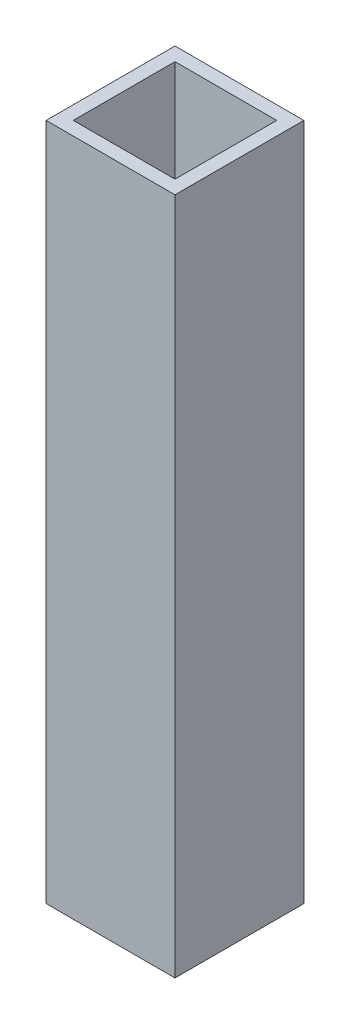
ISO-10303-21;
HEADER;
FILE_DESCRIPTION(('STEP AP214'),'2;1');
FILE_NAME('part.step','',(''),(''),'','','');
FILE_SCHEMA(('AUTOMOTIVE_DESIGN { 1 0 10303 214 1 1 1 1 }'));
ENDSEC;
DATA;
#1=APPLICATION_CONTEXT('core data for automotive mechanical design processes');
#2=APPLICATION_PROTOCOL_DEFINITION('international standard','automotive_design',2000,#1);
#3=PRODUCT_CONTEXT('',#1,'mechanical');
#4=PRODUCT('Part','Part','',(#3));
#5=PRODUCT_RELATED_PRODUCT_CATEGORY('part','',(#4));
#6=PRODUCT_DEFINITION_FORMATION('','',#4);
#7=PRODUCT_DEFINITION_CONTEXT('part definition',#1,'design');
#8=PRODUCT_DEFINITION('design','',#6,#7);
#9=PRODUCT_DEFINITION_SHAPE('','',#8);
#10=(LENGTH_UNIT() NAMED_UNIT(*) SI_UNIT(.MILLI.,.METRE.));
#11=(NAMED_UNIT(*) PLANE_ANGLE_UNIT() SI_UNIT($,.RADIAN.));
#12=(NAMED_UNIT(*) SI_UNIT($,.STERADIAN.) SOLID_ANGLE_UNIT());
#13=UNCERTAINTY_MEASURE_WITH_UNIT(LENGTH_MEASURE(1.E-05),#10,'distance_accuracy_value','');
#14=(GEOMETRIC_REPRESENTATION_CONTEXT(3) GLOBAL_UNCERTAINTY_ASSIGNED_CONTEXT((#13)) GLOBAL_UNIT_ASSIGNED_CONTEXT((#10,
#11,#12)) REPRESENTATION_CONTEXT('',''));
#15=CARTESIAN_POINT('',(0.,0.,0.));
#16=DIRECTION('',(0.,0.,1.));
#17=DIRECTION('',(1.,0.,0.));
#18=AXIS2_PLACEMENT_3D('',#15,#16,#17);
#19=CARTESIAN_POINT('',(0.,100.,0.));
#20=DIRECTION('',(0.,1.,0.));
#21=DIRECTION('',(0.,0.,1.));
#22=AXIS2_PLACEMENT_3D('',#19,#20,#21);
#23=PLANE('',#22);
#24=DIRECTION('',(0.,0.,-1.));
#25=VECTOR('',#24,1.);
#26=CARTESIAN_POINT('',(9.5,100.,9.5));
#27=LINE('',#26,#25);
#28=CARTESIAN_POINT('',(9.5,100.,9.5));
#29=VERTEX_POINT('',#28);
#30=CARTESIAN_POINT('',(9.5,100.,-9.5));
#31=VERTEX_POINT('',#30);
#32=EDGE_CURVE('E181',#29,#31,#27,.T.);
#33=ORIENTED_EDGE('',*,*,#32,.T.);
#34=DIRECTION('',(-1.,0.,0.));
#35=VECTOR('',#34,1.);
#36=CARTESIAN_POINT('',(-9.5,100.,-9.5));
#37=LINE('',#36,#35);
#38=CARTESIAN_POINT('',(-9.5,100.,-9.5));
#39=VERTEX_POINT('',#38);
#40=EDGE_CURVE('E185',#31,#39,#37,.T.);
#41=ORIENTED_EDGE('',*,*,#40,.T.);
#42=DIRECTION('',(0.,0.,1.));
#43=VECTOR('',#42,1.);
#44=CARTESIAN_POINT('',(-9.5,100.,9.5));
#45=LINE('',#44,#43);
#46=CARTESIAN_POINT('',(-9.5,100.,9.5));
#47=VERTEX_POINT('',#46);
#48=EDGE_CURVE('E189',#39,#47,#45,.T.);
#49=ORIENTED_EDGE('',*,*,#48,.T.);
#50=DIRECTION('',(1.,0.,0.));
#51=VECTOR('',#50,1.);
#52=CARTESIAN_POINT('',(-9.5,100.,9.5));
#53=LINE('',#52,#51);
#54=EDGE_CURVE('E192',#47,#29,#53,.T.);
#55=ORIENTED_EDGE('',*,*,#54,.T.);
#56=EDGE_LOOP('',(#33,#41,#49,#55));
#57=FACE_BOUND('',#56,.T.);
#58=DIRECTION('',(-1.,0.,0.));
#59=VECTOR('',#58,1.);
#60=CARTESIAN_POINT('',(0.,100.,-7.5));
#61=LINE('',#60,#59);
#62=CARTESIAN_POINT('',(7.5,100.,-7.5));
#63=VERTEX_POINT('',#62);
#64=CARTESIAN_POINT('',(-7.5,100.,-7.5));
#65=VERTEX_POINT('',#64);
#66=EDGE_CURVE('E142',#63,#65,#61,.T.);
#67=ORIENTED_EDGE('',*,*,#66,.F.);
#68=DIRECTION('',(0.,0.,-1.));
#69=VECTOR('',#68,1.);
#70=CARTESIAN_POINT('',(7.5,100.,0.));
#71=LINE('',#70,#69);
#72=CARTESIAN_POINT('',(7.5,100.,7.5));
#73=VERTEX_POINT('',#72);
#74=EDGE_CURVE('E133',#73,#63,#71,.T.);
#75=ORIENTED_EDGE('',*,*,#74,.F.);
#76=DIRECTION('',(1.,0.,0.));
#77=VECTOR('',#76,1.);
#78=CARTESIAN_POINT('',(0.,100.,7.5));
#79=LINE('',#78,#77);
#80=CARTESIAN_POINT('',(-7.5,100.,7.5));
#81=VERTEX_POINT('',#80);
#82=EDGE_CURVE('E159',#81,#73,#79,.T.);
#83=ORIENTED_EDGE('',*,*,#82,.F.);
#84=DIRECTION('',(0.,0.,1.));
#85=VECTOR('',#84,1.);
#86=CARTESIAN_POINT('',(-7.5,100.,0.));
#87=LINE('',#86,#85);
#88=EDGE_CURVE('E155',#65,#81,#87,.T.);
#89=ORIENTED_EDGE('',*,*,#88,.F.);
#90=EDGE_LOOP('',(#67,#75,#83,#89));
#91=FACE_BOUND('',#90,.T.);
#92=ADVANCED_FACE('F67',(#57,#91),#23,.T.);
#93=CARTESIAN_POINT('',(0.,0.,0.));
#94=DIRECTION('',(0.,1.,0.));
#95=DIRECTION('',(0.,0.,1.));
#96=AXIS2_PLACEMENT_3D('',#93,#94,#95);
#97=PLANE('',#96);
#98=DIRECTION('',(0.,0.,-1.));
#99=VECTOR('',#98,1.);
#100=CARTESIAN_POINT('',(9.5,0.,9.5));
#101=LINE('',#100,#99);
#102=CARTESIAN_POINT('',(9.5,0.,9.5));
#103=VERTEX_POINT('',#102);
#104=CARTESIAN_POINT('',(9.5,0.,-9.5));
#105=VERTEX_POINT('',#104);
#106=EDGE_CURVE('E151',#103,#105,#101,.T.);
#107=ORIENTED_EDGE('',*,*,#106,.F.);
#108=DIRECTION('',(1.,0.,0.));
#109=VECTOR('',#108,1.);
#110=CARTESIAN_POINT('',(-9.5,0.,9.5));
#111=LINE('',#110,#109);
#112=CARTESIAN_POINT('',(-9.5,0.,9.5));
#113=VERTEX_POINT('',#112);
#114=EDGE_CURVE('E186',#113,#103,#111,.T.);
#115=ORIENTED_EDGE('',*,*,#114,.F.);
#116=DIRECTION('',(0.,0.,1.));
#117=VECTOR('',#116,1.);
#118=CARTESIAN_POINT('',(-9.5,0.,9.5));
#119=LINE('',#118,#117);
#120=CARTESIAN_POINT('',(-9.5,0.,-9.5));
#121=VERTEX_POINT('',#120);
#122=EDGE_CURVE('E202',#121,#113,#119,.T.);
#123=ORIENTED_EDGE('',*,*,#122,.F.);
#124=DIRECTION('',(-1.,0.,0.));
#125=VECTOR('',#124,1.);
#126=CARTESIAN_POINT('',(-9.5,0.,-9.5));
#127=LINE('',#126,#125);
#128=EDGE_CURVE('E199',#105,#121,#127,.T.);
#129=ORIENTED_EDGE('',*,*,#128,.F.);
#130=EDGE_LOOP('',(#107,#115,#123,#129));
#131=FACE_BOUND('',#130,.T.);
#132=DIRECTION('',(0.,0.,-1.));
#133=VECTOR('',#132,1.);
#134=CARTESIAN_POINT('',(7.5,0.,0.));
#135=LINE('',#134,#133);
#136=CARTESIAN_POINT('',(7.5,0.,7.5));
#137=VERTEX_POINT('',#136);
#138=CARTESIAN_POINT('',(7.5,0.,-7.5));
#139=VERTEX_POINT('',#138);
#140=EDGE_CURVE('E91',#137,#139,#135,.T.);
#141=ORIENTED_EDGE('',*,*,#140,.T.);
#142=DIRECTION('',(-1.,0.,0.));
#143=VECTOR('',#142,1.);
#144=CARTESIAN_POINT('',(0.,0.,-7.5));
#145=LINE('',#144,#143);
#146=CARTESIAN_POINT('',(-7.5,0.,-7.5));
#147=VERTEX_POINT('',#146);
#148=EDGE_CURVE('E149',#139,#147,#145,.T.);
#149=ORIENTED_EDGE('',*,*,#148,.T.);
#150=DIRECTION('',(0.,0.,1.));
#151=VECTOR('',#150,1.);
#152=CARTESIAN_POINT('',(-7.5,0.,0.));
#153=LINE('',#152,#151);
#154=CARTESIAN_POINT('',(-7.5,0.,7.5));
#155=VERTEX_POINT('',#154);
#156=EDGE_CURVE('E168',#147,#155,#153,.T.);
#157=ORIENTED_EDGE('',*,*,#156,.T.);
#158=DIRECTION('',(1.,0.,0.));
#159=VECTOR('',#158,1.);
#160=CARTESIAN_POINT('',(0.,0.,7.5));
#161=LINE('',#160,#159);
#162=EDGE_CURVE('E143',#155,#137,#161,.T.);
#163=ORIENTED_EDGE('',*,*,#162,.T.);
#164=EDGE_LOOP('',(#141,#149,#157,#163));
#165=FACE_BOUND('',#164,.T.);
#166=ADVANCED_FACE('F225',(#131,#165),#97,.F.);
#167=CARTESIAN_POINT('',(9.5,100.,9.5));
#168=DIRECTION('',(-1.,0.,0.));
#169=DIRECTION('',(0.,0.,1.));
#170=AXIS2_PLACEMENT_3D('',#167,#168,#169);
#171=PLANE('',#170);
#172=ORIENTED_EDGE('',*,*,#106,.T.);
#173=DIRECTION('',(0.,-1.,0.));
#174=VECTOR('',#173,1.);
#175=CARTESIAN_POINT('',(9.5,100.,-9.5));
#176=LINE('',#175,#174);
#177=EDGE_CURVE('E12',#31,#105,#176,.T.);
#178=ORIENTED_EDGE('',*,*,#177,.F.);
#179=ORIENTED_EDGE('',*,*,#32,.F.);
#180=DIRECTION('',(0.,-1.,0.));
#181=VECTOR('',#180,1.);
#182=CARTESIAN_POINT('',(9.5,100.,9.5));
#183=LINE('',#182,#181);
#184=EDGE_CURVE('E195',#29,#103,#183,.T.);
#185=ORIENTED_EDGE('',*,*,#184,.T.);
#186=EDGE_LOOP('',(#172,#178,#179,#185));
#187=FACE_BOUND('',#186,.T.);
#188=ADVANCED_FACE('F69',(#187),#171,.F.);
#189=CARTESIAN_POINT('',(-9.5,100.,-9.5));
#190=DIRECTION('',(0.,0.,1.));
#191=DIRECTION('',(1.,0.,0.));
#192=AXIS2_PLACEMENT_3D('',#189,#190,#191);
#193=PLANE('',#192);
#194=ORIENTED_EDGE('',*,*,#128,.T.);
#195=DIRECTION('',(0.,-1.,0.));
#196=VECTOR('',#195,1.);
#197=CARTESIAN_POINT('',(-9.5,100.,-9.5));
#198=LINE('',#197,#196);
#199=EDGE_CURVE('E76',#39,#121,#198,.T.);
#200=ORIENTED_EDGE('',*,*,#199,.F.);
#201=ORIENTED_EDGE('',*,*,#40,.F.);
#202=ORIENTED_EDGE('',*,*,#177,.T.);
#203=EDGE_LOOP('',(#194,#200,#201,#202));
#204=FACE_BOUND('',#203,.T.);
#205=ADVANCED_FACE('F235',(#204),#193,.F.);
#206=CARTESIAN_POINT('',(-9.5,100.,9.5));
#207=DIRECTION('',(1.,0.,0.));
#208=DIRECTION('',(0.,0.,-1.));
#209=AXIS2_PLACEMENT_3D('',#206,#207,#208);
#210=PLANE('',#209);
#211=ORIENTED_EDGE('',*,*,#122,.T.);
#212=DIRECTION('',(0.,-1.,0.));
#213=VECTOR('',#212,1.);
#214=CARTESIAN_POINT('',(-9.5,100.,9.5));
#215=LINE('',#214,#213);
#216=EDGE_CURVE('E210',#47,#113,#215,.T.);
#217=ORIENTED_EDGE('',*,*,#216,.F.);
#218=ORIENTED_EDGE('',*,*,#48,.F.);
#219=ORIENTED_EDGE('',*,*,#199,.T.);
#220=EDGE_LOOP('',(#211,#217,#218,#219));
#221=FACE_BOUND('',#220,.T.);
#222=ADVANCED_FACE('F219',(#221),#210,.F.);
#223=CARTESIAN_POINT('',(-9.5,100.,9.5));
#224=DIRECTION('',(0.,0.,-1.));
#225=DIRECTION('',(-1.,0.,0.));
#226=AXIS2_PLACEMENT_3D('',#223,#224,#225);
#227=PLANE('',#226);
#228=ORIENTED_EDGE('',*,*,#114,.T.);
#229=ORIENTED_EDGE('',*,*,#184,.F.);
#230=ORIENTED_EDGE('',*,*,#54,.F.);
#231=ORIENTED_EDGE('',*,*,#216,.T.);
#232=EDGE_LOOP('',(#228,#229,#230,#231));
#233=FACE_BOUND('',#232,.T.);
#234=ADVANCED_FACE('F229',(#233),#227,.F.);
#235=CARTESIAN_POINT('',(7.5,100.,0.));
#236=DIRECTION('',(-1.,0.,0.));
#237=DIRECTION('',(0.,0.,1.));
#238=AXIS2_PLACEMENT_3D('',#235,#236,#237);
#239=PLANE('',#238);
#240=ORIENTED_EDGE('',*,*,#140,.F.);
#241=DIRECTION('',(0.,-1.,0.));
#242=VECTOR('',#241,1.);
#243=CARTESIAN_POINT('',(7.5,100.,7.5));
#244=LINE('',#243,#242);
#245=EDGE_CURVE('E137',#73,#137,#244,.T.);
#246=ORIENTED_EDGE('',*,*,#245,.F.);
#247=ORIENTED_EDGE('',*,*,#74,.T.);
#248=DIRECTION('',(0.,-1.,0.));
#249=VECTOR('',#248,1.);
#250=CARTESIAN_POINT('',(7.5,100.,-7.5));
#251=LINE('',#250,#249);
#252=EDGE_CURVE('E136',#63,#139,#251,.T.);
#253=ORIENTED_EDGE('',*,*,#252,.T.);
#254=EDGE_LOOP('',(#240,#246,#247,#253));
#255=FACE_BOUND('',#254,.T.);
#256=ADVANCED_FACE('F135',(#255),#239,.T.);
#257=CARTESIAN_POINT('',(0.,100.,-7.5));
#258=DIRECTION('',(0.,0.,1.));
#259=DIRECTION('',(1.,0.,0.));
#260=AXIS2_PLACEMENT_3D('',#257,#258,#259);
#261=PLANE('',#260);
#262=ORIENTED_EDGE('',*,*,#148,.F.);
#263=ORIENTED_EDGE('',*,*,#252,.F.);
#264=ORIENTED_EDGE('',*,*,#66,.T.);
#265=DIRECTION('',(0.,-1.,0.));
#266=VECTOR('',#265,1.);
#267=CARTESIAN_POINT('',(-7.5,100.,-7.5));
#268=LINE('',#267,#266);
#269=EDGE_CURVE('E152',#65,#147,#268,.T.);
#270=ORIENTED_EDGE('',*,*,#269,.T.);
#271=EDGE_LOOP('',(#262,#263,#264,#270));
#272=FACE_BOUND('',#271,.T.);
#273=ADVANCED_FACE('F146',(#272),#261,.T.);
#274=CARTESIAN_POINT('',(-7.5,100.,0.));
#275=DIRECTION('',(1.,0.,0.));
#276=DIRECTION('',(0.,0.,-1.));
#277=AXIS2_PLACEMENT_3D('',#274,#275,#276);
#278=PLANE('',#277);
#279=ORIENTED_EDGE('',*,*,#156,.F.);
#280=ORIENTED_EDGE('',*,*,#269,.F.);
#281=ORIENTED_EDGE('',*,*,#88,.T.);
#282=DIRECTION('',(0.,-1.,0.));
#283=VECTOR('',#282,1.);
#284=CARTESIAN_POINT('',(-7.5,100.,7.5));
#285=LINE('',#284,#283);
#286=EDGE_CURVE('E83',#81,#155,#285,.T.);
#287=ORIENTED_EDGE('',*,*,#286,.T.);
#288=EDGE_LOOP('',(#279,#280,#281,#287));
#289=FACE_BOUND('',#288,.T.);
#290=ADVANCED_FACE('F258',(#289),#278,.T.);
#291=CARTESIAN_POINT('',(0.,100.,7.5));
#292=DIRECTION('',(0.,0.,-1.));
#293=DIRECTION('',(-1.,0.,0.));
#294=AXIS2_PLACEMENT_3D('',#291,#292,#293);
#295=PLANE('',#294);
#296=ORIENTED_EDGE('',*,*,#162,.F.);
#297=ORIENTED_EDGE('',*,*,#286,.F.);
#298=ORIENTED_EDGE('',*,*,#82,.T.);
#299=ORIENTED_EDGE('',*,*,#245,.T.);
#300=EDGE_LOOP('',(#296,#297,#298,#299));
#301=FACE_BOUND('',#300,.T.);
#302=ADVANCED_FACE('F262',(#301),#295,.T.);
#303=CLOSED_SHELL('',(#92,#166,#188,#205,#222,#234,#256,#273,#290,#302));
#304=MANIFOLD_SOLID_BREP('B2',#303);
#305=ADVANCED_BREP_SHAPE_REPRESENTATION('',(#18,#304),#14);
#306=SHAPE_DEFINITION_REPRESENTATION(#9,#305);
ENDSEC;
END-ISO-10303-21;
